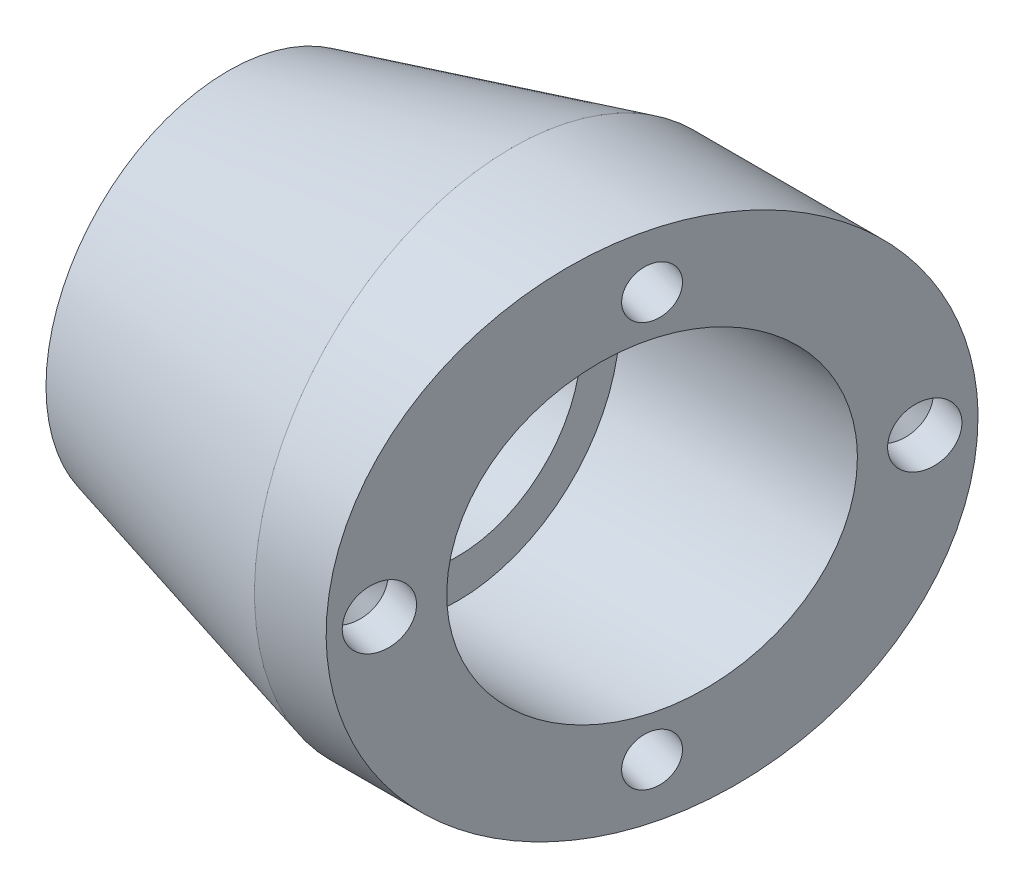
ISO-10303-21;
HEADER;
FILE_DESCRIPTION(('STEP AP214'),'2;1');
FILE_NAME('part.step','',(''),(''),'','','');
FILE_SCHEMA(('AUTOMOTIVE_DESIGN { 1 0 10303 214 1 1 1 1 }'));
ENDSEC;
DATA;
#1=APPLICATION_CONTEXT('core data for automotive mechanical design processes');
#2=APPLICATION_PROTOCOL_DEFINITION('international standard','automotive_design',2000,#1);
#3=PRODUCT_CONTEXT('',#1,'mechanical');
#4=PRODUCT('Part','Part','',(#3));
#5=PRODUCT_RELATED_PRODUCT_CATEGORY('part','',(#4));
#6=PRODUCT_DEFINITION_FORMATION('','',#4);
#7=PRODUCT_DEFINITION_CONTEXT('part definition',#1,'design');
#8=PRODUCT_DEFINITION('design','',#6,#7);
#9=PRODUCT_DEFINITION_SHAPE('','',#8);
#10=(LENGTH_UNIT() NAMED_UNIT(*) SI_UNIT(.MILLI.,.METRE.));
#11=(NAMED_UNIT(*) PLANE_ANGLE_UNIT() SI_UNIT($,.RADIAN.));
#12=(NAMED_UNIT(*) SI_UNIT($,.STERADIAN.) SOLID_ANGLE_UNIT());
#13=UNCERTAINTY_MEASURE_WITH_UNIT(LENGTH_MEASURE(1.E-05),#10,'distance_accuracy_value','');
#14=(GEOMETRIC_REPRESENTATION_CONTEXT(3) GLOBAL_UNCERTAINTY_ASSIGNED_CONTEXT((#13)) GLOBAL_UNIT_ASSIGNED_CONTEXT((#10,
#11,#12)) REPRESENTATION_CONTEXT('',''));
#15=CARTESIAN_POINT('',(0.,0.,0.));
#16=DIRECTION('',(0.,0.,1.));
#17=DIRECTION('',(1.,0.,0.));
#18=AXIS2_PLACEMENT_3D('',#15,#16,#17);
#19=CARTESIAN_POINT('',(0.254,0.,0.));
#20=DIRECTION('',(1.,0.,0.));
#21=DIRECTION('',(0.,0.,-1.));
#22=AXIS2_PLACEMENT_3D('',#19,#20,#21);
#23=CYLINDRICAL_SURFACE('',#22,8.001);
#24=CARTESIAN_POINT('',(0.254000000113976,0.,0.));
#25=DIRECTION('',(-1.,0.,0.));
#26=DIRECTION('',(0.,-1.,0.));
#27=AXIS2_PLACEMENT_3D('',#24,#25,#26);
#28=CIRCLE('',#27,8.00100000011398);
#29=CARTESIAN_POINT('',(0.254000000113976,-8.00100000011398,0.));
#30=VERTEX_POINT('',#29);
#31=EDGE_CURVE('E102',#30,#30,#28,.T.);
#32=ORIENTED_EDGE('',*,*,#31,.T.);
#33=EDGE_LOOP('',(#32));
#34=FACE_BOUND('',#33,.T.);
#35=CARTESIAN_POINT('',(4.99999999999999,0.,0.));
#36=DIRECTION('',(1.,0.,0.));
#37=DIRECTION('',(0.,0.,-1.));
#38=AXIS2_PLACEMENT_3D('',#35,#36,#37);
#39=CIRCLE('',#38,8.001);
#40=CARTESIAN_POINT('',(4.99999999999999,0.,-8.001));
#41=VERTEX_POINT('',#40);
#42=EDGE_CURVE('E20',#41,#41,#39,.F.);
#43=ORIENTED_EDGE('',*,*,#42,.F.);
#44=EDGE_LOOP('',(#43));
#45=FACE_BOUND('',#44,.T.);
#46=ADVANCED_FACE('F16',(#34,#45),#23,.F.);
#47=CARTESIAN_POINT('',(-1.13975994441018E-10,0.,0.));
#48=DIRECTION('',(-1.,0.,0.));
#49=DIRECTION('',(0.,0.,1.));
#50=AXIS2_PLACEMENT_3D('',#47,#48,#49);
#51=CONICAL_SURFACE('',#50,8.25499999988603,0.785398162499999);
#52=CARTESIAN_POINT('',(-1.13976536542104E-10,0.,0.));
#53=DIRECTION('',(-1.,0.,0.));
#54=DIRECTION('',(0.,0.,1.));
#55=AXIS2_PLACEMENT_3D('',#52,#53,#54);
#56=CIRCLE('',#55,8.25499999988603);
#57=CARTESIAN_POINT('',(-1.13976536542104E-10,0.,8.25499999988603));
#58=VERTEX_POINT('',#57);
#59=EDGE_CURVE('E106',#58,#58,#56,.F.);
#60=ORIENTED_EDGE('',*,*,#59,.F.);
#61=EDGE_LOOP('',(#60));
#62=FACE_BOUND('',#61,.T.);
#63=ORIENTED_EDGE('',*,*,#31,.F.);
#64=EDGE_LOOP('',(#63));
#65=FACE_BOUND('',#64,.T.);
#66=ADVANCED_FACE('F90',(#62,#65),#51,.F.);
#67=CARTESIAN_POINT('',(4.99999999999999,7.0485,0.));
#68=DIRECTION('',(-1.,0.,0.));
#69=DIRECTION('',(0.,0.,1.));
#70=AXIS2_PLACEMENT_3D('',#67,#68,#69);
#71=PLANE('',#70);
#72=CARTESIAN_POINT('',(4.99999999999999,0.,0.));
#73=DIRECTION('',(1.,0.,0.));
#74=DIRECTION('',(0.,0.,-1.));
#75=AXIS2_PLACEMENT_3D('',#72,#73,#74);
#76=CIRCLE('',#75,6.096);
#77=CARTESIAN_POINT('',(4.99999999999999,0.,-6.096));
#78=VERTEX_POINT('',#77);
#79=EDGE_CURVE('E108',#78,#78,#76,.T.);
#80=ORIENTED_EDGE('',*,*,#79,.T.);
#81=EDGE_LOOP('',(#80));
#82=FACE_BOUND('',#81,.T.);
#83=ORIENTED_EDGE('',*,*,#42,.T.);
#84=EDGE_LOOP('',(#83));
#85=FACE_BOUND('',#84,.T.);
#86=ADVANCED_FACE('F86',(#82,#85),#71,.T.);
#87=CARTESIAN_POINT('',(0.,10.3505,0.));
#88=DIRECTION('',(-1.,0.,0.));
#89=DIRECTION('',(0.,0.,1.));
#90=AXIS2_PLACEMENT_3D('',#87,#88,#89);
#91=PLANE('',#90);
#92=ORIENTED_EDGE('',*,*,#59,.T.);
#93=EDGE_LOOP('',(#92));
#94=FACE_BOUND('',#93,.T.);
#95=CARTESIAN_POINT('',(-5.46201972539961E-10,0.,0.));
#96=DIRECTION('',(1.,0.,0.));
#97=DIRECTION('',(0.,1.,0.));
#98=AXIS2_PLACEMENT_3D('',#95,#96,#97);
#99=CIRCLE('',#98,9.00000000206669);
#100=CARTESIAN_POINT('',(-5.46201357874163E-10,9.0000000020667,0.));
#101=VERTEX_POINT('',#100);
#102=EDGE_CURVE('E135',#101,#101,#99,.T.);
#103=ORIENTED_EDGE('',*,*,#102,.F.);
#104=EDGE_LOOP('',(#103));
#105=FACE_BOUND('',#104,.T.);
#106=ADVANCED_FACE('F82',(#94,#105),#91,.T.);
#107=CARTESIAN_POINT('',(4.99999999999999,0.,0.));
#108=DIRECTION('',(1.,0.,0.));
#109=DIRECTION('',(0.,0.,-1.));
#110=AXIS2_PLACEMENT_3D('',#107,#108,#109);
#111=CYLINDRICAL_SURFACE('',#110,6.096);
#112=ORIENTED_EDGE('',*,*,#79,.F.);
#113=EDGE_LOOP('',(#112));
#114=FACE_BOUND('',#113,.T.);
#115=CARTESIAN_POINT('',(11.35,0.,0.));
#116=DIRECTION('',(1.,0.,0.));
#117=DIRECTION('',(0.,0.,-1.));
#118=AXIS2_PLACEMENT_3D('',#115,#116,#117);
#119=CIRCLE('',#118,6.096);
#120=CARTESIAN_POINT('',(11.35,0.,-6.096));
#121=VERTEX_POINT('',#120);
#122=EDGE_CURVE('E132',#121,#121,#119,.F.);
#123=ORIENTED_EDGE('',*,*,#122,.F.);
#124=EDGE_LOOP('',(#123));
#125=FACE_BOUND('',#124,.T.);
#126=ADVANCED_FACE('F53',(#114,#125),#111,.F.);
#127=CARTESIAN_POINT('',(14.0000000005462,0.,0.));
#128=DIRECTION('',(1.,0.,0.));
#129=DIRECTION('',(0.,1.,0.));
#130=AXIS2_PLACEMENT_3D('',#127,#128,#129);
#131=CONICAL_SURFACE('',#130,12.6999999979333,0.258378195831585);
#132=ORIENTED_EDGE('',*,*,#102,.T.);
#133=EDGE_LOOP('',(#132));
#134=FACE_BOUND('',#133,.T.);
#135=CARTESIAN_POINT('',(14.,0.,0.));
#136=DIRECTION('',(1.,0.,0.));
#137=DIRECTION('',(0.,1.,0.));
#138=AXIS2_PLACEMENT_3D('',#135,#136,#137);
#139=CIRCLE('',#138,12.7);
#140=CARTESIAN_POINT('',(14.,12.7,0.));
#141=VERTEX_POINT('',#140);
#142=EDGE_CURVE('E111',#141,#141,#139,.T.);
#143=ORIENTED_EDGE('',*,*,#142,.F.);
#144=EDGE_LOOP('',(#143));
#145=FACE_BOUND('',#144,.T.);
#146=ADVANCED_FACE('F42',(#134,#145),#131,.T.);
#147=CARTESIAN_POINT('',(15.7414932001015,10.,-1.39380526263836));
#148=DIRECTION('',(0.965925826289068,0.,0.258819045102523));
#149=DIRECTION('',(0.258819045102522,0.,-0.965925826289068));
#150=AXIS2_PLACEMENT_3D('',#147,#148,#149);
#151=CONICAL_SURFACE('',#150,2.25261581177498,1.02974425867665);
#152=CARTESIAN_POINT('',(15.1476902983903,10.,-1.55291427061513));
#153=DIRECTION('',(0.965925826289069,0.,0.258819045102519));
#154=DIRECTION('',(0.258819045102519,0.,-0.965925826289069));
#155=AXIS2_PLACEMENT_3D('',#152,#153,#154);
#156=CIRCLE('',#155,1.22950000000001);
#157=CARTESIAN_POINT('',(15.4659083143439,10.,-2.74052007403756));
#158=VERTEX_POINT('',#157);
#159=EDGE_CURVE('E150',#158,#158,#156,.T.);
#160=ORIENTED_EDGE('',*,*,#159,.T.);
#161=EDGE_LOOP('',(#160));
#162=FACE_BOUND('',#161,.T.);
#163=CARTESIAN_POINT('',(14.4341047401852,10.,-1.74411894466669));
#164=VERTEX_POINT('',#163);
#165=VERTEX_LOOP('',#164);
#166=FACE_BOUND('',#165,.T.);
#167=ADVANCED_FACE('F39',(#162,#166),#151,.F.);
#168=CARTESIAN_POINT('',(15.7414932001015,-10.,-1.39380526263836));
#169=DIRECTION('',(0.965925826289068,0.,0.258819045102523));
#170=DIRECTION('',(0.258819045102522,0.,-0.965925826289068));
#171=AXIS2_PLACEMENT_3D('',#168,#169,#170);
#172=CONICAL_SURFACE('',#171,2.25261581177499,1.02974425867665);
#173=CARTESIAN_POINT('',(15.1476902983903,-10.,-1.55291427061514));
#174=DIRECTION('',(0.965925826289069,0.,0.258819045102519));
#175=DIRECTION('',(0.258819045102519,0.,-0.965925826289069));
#176=AXIS2_PLACEMENT_3D('',#173,#174,#175);
#177=CIRCLE('',#176,1.2295);
#178=CARTESIAN_POINT('',(15.4659083143439,-10.,-2.74052007403755));
#179=VERTEX_POINT('',#178);
#180=EDGE_CURVE('E151',#179,#179,#177,.T.);
#181=ORIENTED_EDGE('',*,*,#180,.T.);
#182=EDGE_LOOP('',(#181));
#183=FACE_BOUND('',#182,.T.);
#184=CARTESIAN_POINT('',(14.4341047401852,-10.,-1.74411894466669));
#185=VERTEX_POINT('',#184);
#186=VERTEX_LOOP('',#185);
#187=FACE_BOUND('',#186,.T.);
#188=ADVANCED_FACE('F41',(#183,#187),#172,.F.);
#189=CARTESIAN_POINT('',(16.8888284771357,0.,10.3016602828016));
#190=DIRECTION('',(0.965925826289068,0.,0.258819045102521));
#191=DIRECTION('',(0.258819045102521,0.,-0.965925826289068));
#192=AXIS2_PLACEMENT_3D('',#189,#190,#191);
#193=CONICAL_SURFACE('',#192,2.74820961176289,1.02974425867665);
#194=CARTESIAN_POINT('',(16.1643841074189,0.,10.1075459989747));
#195=DIRECTION('',(0.965925826289069,0.,0.258819045102519));
#196=DIRECTION('',(0.258819045102519,0.,-0.965925826289069));
#197=AXIS2_PLACEMENT_3D('',#194,#195,#196);
#198=CIRCLE('',#197,1.5);
#199=CARTESIAN_POINT('',(16.5526126750727,0.,8.65865725954111));
#200=VERTEX_POINT('',#199);
#201=EDGE_CURVE('E154',#200,#200,#198,.T.);
#202=ORIENTED_EDGE('',*,*,#201,.T.);
#203=EDGE_LOOP('',(#202));
#204=FACE_BOUND('',#203,.T.);
#205=CARTESIAN_POINT('',(15.2938039225408,0.,9.87427474149009));
#206=VERTEX_POINT('',#205);
#207=VERTEX_LOOP('',#206);
#208=FACE_BOUND('',#207,.T.);
#209=ADVANCED_FACE('F50',(#204,#208),#193,.F.);
#210=CARTESIAN_POINT('',(22.5828474693911,0.,-10.9487078955579));
#211=DIRECTION('',(0.965925826289068,0.,0.258819045102522));
#212=DIRECTION('',(0.258819045102522,0.,-0.965925826289068));
#213=AXIS2_PLACEMENT_3D('',#210,#211,#212);
#214=CONICAL_SURFACE('',#213,2.74820961176289,1.02974425867665);
#215=CARTESIAN_POINT('',(21.8584030996743,0.,-11.1428221793848));
#216=DIRECTION('',(0.965925826289069,0.,0.258819045102518));
#217=DIRECTION('',(0.258819045102518,0.,-0.965925826289069));
#218=AXIS2_PLACEMENT_3D('',#215,#216,#217);
#219=CIRCLE('',#218,1.5);
#220=CARTESIAN_POINT('',(22.2466316673281,0.,-12.5917109188184));
#221=VERTEX_POINT('',#220);
#222=EDGE_CURVE('E131',#221,#221,#219,.T.);
#223=ORIENTED_EDGE('',*,*,#222,.T.);
#224=EDGE_LOOP('',(#223));
#225=FACE_BOUND('',#224,.T.);
#226=CARTESIAN_POINT('',(20.9878229147962,0.,-11.3760934368694));
#227=VERTEX_POINT('',#226);
#228=VERTEX_LOOP('',#227);
#229=FACE_BOUND('',#228,.T.);
#230=ADVANCED_FACE('F77',(#225,#229),#214,.F.);
#231=CARTESIAN_POINT('',(11.35,7.0485,0.));
#232=DIRECTION('',(1.,0.,0.));
#233=DIRECTION('',(0.,0.,-1.));
#234=AXIS2_PLACEMENT_3D('',#231,#232,#233);
#235=PLANE('',#234);
#236=ORIENTED_EDGE('',*,*,#122,.T.);
#237=EDGE_LOOP('',(#236));
#238=FACE_BOUND('',#237,.T.);
#239=CARTESIAN_POINT('',(11.35,0.,0.));
#240=DIRECTION('',(1.,0.,0.));
#241=DIRECTION('',(0.,0.,-1.));
#242=AXIS2_PLACEMENT_3D('',#239,#240,#241);
#243=CIRCLE('',#242,8.001);
#244=CARTESIAN_POINT('',(11.35,0.,-8.001));
#245=VERTEX_POINT('',#244);
#246=EDGE_CURVE('E128',#245,#245,#243,.T.);
#247=ORIENTED_EDGE('',*,*,#246,.T.);
#248=EDGE_LOOP('',(#247));
#249=FACE_BOUND('',#248,.T.);
#250=ADVANCED_FACE('F74',(#238,#249),#235,.T.);
#251=CARTESIAN_POINT('',(14.,0.,0.));
#252=DIRECTION('',(1.,0.,0.));
#253=DIRECTION('',(0.,0.,-1.));
#254=AXIS2_PLACEMENT_3D('',#251,#252,#253);
#255=CYLINDRICAL_SURFACE('',#254,12.7);
#256=ORIENTED_EDGE('',*,*,#142,.T.);
#257=EDGE_LOOP('',(#256));
#258=FACE_BOUND('',#257,.T.);
#259=CARTESIAN_POINT('',(20.9432452561248,0.,0.));
#260=DIRECTION('',(-0.965925826289068,0.,-0.258819045102521));
#261=DIRECTION('',(0.258819045102521,0.,-0.965925826289068));
#262=AXIS2_PLACEMENT_3D('',#259,#260,#261);
#263=ELLIPSE('',#262,13.1480074912081,12.7);
#264=CARTESIAN_POINT('',(24.3462,0.,-12.7));
#265=VERTEX_POINT('',#264);
#266=EDGE_CURVE('E125',#265,#265,#263,.T.);
#267=ORIENTED_EDGE('',*,*,#266,.T.);
#268=EDGE_LOOP('',(#267));
#269=FACE_BOUND('',#268,.T.);
#270=ADVANCED_FACE('F70',(#258,#269),#255,.T.);
#271=CARTESIAN_POINT('',(21.5370481578359,10.,0.159109007976775));
#272=DIRECTION('',(-0.965925826289069,0.,-0.25881904510252));
#273=DIRECTION('',(-0.25881904510252,0.,0.965925826289069));
#274=AXIS2_PLACEMENT_3D('',#271,#272,#273);
#275=CYLINDRICAL_SURFACE('',#274,1.2295);
#276=ORIENTED_EDGE('',*,*,#159,.F.);
#277=EDGE_LOOP('',(#276));
#278=FACE_BOUND('',#277,.T.);
#279=CARTESIAN_POINT('',(20.9432452561248,10.,0.));
#280=DIRECTION('',(-0.965925826289069,0.,-0.25881904510252));
#281=DIRECTION('',(-0.25881904510252,0.,0.965925826289069));
#282=AXIS2_PLACEMENT_3D('',#279,#280,#281);
#283=CIRCLE('',#282,1.2295);
#284=CARTESIAN_POINT('',(20.6250272401712,10.,1.18760580342242));
#285=VERTEX_POINT('',#284);
#286=EDGE_CURVE('E122',#285,#285,#283,.F.);
#287=ORIENTED_EDGE('',*,*,#286,.T.);
#288=EDGE_LOOP('',(#287));
#289=FACE_BOUND('',#288,.T.);
#290=ADVANCED_FACE('F73',(#278,#289),#275,.F.);
#291=CARTESIAN_POINT('',(21.5370481578359,-10.,0.159109007976773));
#292=DIRECTION('',(-0.965925826289069,0.,-0.25881904510252));
#293=DIRECTION('',(-0.25881904510252,0.,0.965925826289069));
#294=AXIS2_PLACEMENT_3D('',#291,#292,#293);
#295=CYLINDRICAL_SURFACE('',#294,1.22949999999999);
#296=ORIENTED_EDGE('',*,*,#180,.F.);
#297=EDGE_LOOP('',(#296));
#298=FACE_BOUND('',#297,.T.);
#299=CARTESIAN_POINT('',(20.9432452561248,-10.,0.));
#300=DIRECTION('',(-0.965925826289069,0.,-0.25881904510252));
#301=DIRECTION('',(-0.25881904510252,0.,0.965925826289069));
#302=AXIS2_PLACEMENT_3D('',#299,#300,#301);
#303=CIRCLE('',#302,1.22949999999999);
#304=CARTESIAN_POINT('',(20.6250272401712,-10.,1.18760580342241));
#305=VERTEX_POINT('',#304);
#306=EDGE_CURVE('E119',#305,#305,#303,.F.);
#307=ORIENTED_EDGE('',*,*,#306,.T.);
#308=EDGE_LOOP('',(#307));
#309=FACE_BOUND('',#308,.T.);
#310=ADVANCED_FACE('F178',(#298,#309),#295,.F.);
#311=CARTESIAN_POINT('',(18.8206801297138,0.,10.8192983730066));
#312=DIRECTION('',(-0.965925826289068,0.,-0.258819045102522));
#313=DIRECTION('',(-0.258819045102522,0.,0.965925826289068));
#314=AXIS2_PLACEMENT_3D('',#311,#312,#313);
#315=CYLINDRICAL_SURFACE('',#314,1.5);
#316=ORIENTED_EDGE('',*,*,#201,.F.);
#317=EDGE_LOOP('',(#316));
#318=FACE_BOUND('',#317,.T.);
#319=CARTESIAN_POINT('',(18.096235759997,0.,10.6251840891798));
#320=DIRECTION('',(-0.965925826289068,0.,-0.258819045102522));
#321=DIRECTION('',(-0.258819045102522,0.,0.965925826289068));
#322=AXIS2_PLACEMENT_3D('',#319,#320,#321);
#323=CIRCLE('',#322,1.5);
#324=CARTESIAN_POINT('',(17.7080071923432,0.,12.0740728286134));
#325=VERTEX_POINT('',#324);
#326=EDGE_CURVE('E116',#325,#325,#323,.F.);
#327=ORIENTED_EDGE('',*,*,#326,.T.);
#328=EDGE_LOOP('',(#327));
#329=FACE_BOUND('',#328,.T.);
#330=ADVANCED_FACE('F165',(#318,#329),#315,.F.);
#331=CARTESIAN_POINT('',(24.5146991219693,0.,-10.4310698053529));
#332=DIRECTION('',(-0.965925826289067,0.,-0.258819045102525));
#333=DIRECTION('',(-0.258819045102525,0.,0.965925826289067));
#334=AXIS2_PLACEMENT_3D('',#331,#332,#333);
#335=CYLINDRICAL_SURFACE('',#334,1.49999999999999);
#336=ORIENTED_EDGE('',*,*,#222,.F.);
#337=EDGE_LOOP('',(#336));
#338=FACE_BOUND('',#337,.T.);
#339=CARTESIAN_POINT('',(23.7902547522525,0.,-10.6251840891797));
#340=DIRECTION('',(-0.965925826289067,0.,-0.258819045102525));
#341=DIRECTION('',(-0.258819045102525,0.,0.965925826289067));
#342=AXIS2_PLACEMENT_3D('',#339,#340,#341);
#343=CIRCLE('',#342,1.49999999999999);
#344=CARTESIAN_POINT('',(23.4020261845987,0.,-9.17629534974616));
#345=VERTEX_POINT('',#344);
#346=EDGE_CURVE('E26',#345,#345,#343,.F.);
#347=ORIENTED_EDGE('',*,*,#346,.T.);
#348=EDGE_LOOP('',(#347));
#349=FACE_BOUND('',#348,.T.);
#350=ADVANCED_FACE('F18',(#338,#349),#335,.F.);
#351=CARTESIAN_POINT('',(11.35,0.,0.));
#352=DIRECTION('',(1.,0.,0.));
#353=DIRECTION('',(0.,0.,-1.));
#354=AXIS2_PLACEMENT_3D('',#351,#352,#353);
#355=CYLINDRICAL_SURFACE('',#354,8.001);
#356=ORIENTED_EDGE('',*,*,#246,.F.);
#357=EDGE_LOOP('',(#356));
#358=FACE_BOUND('',#357,.T.);
#359=CARTESIAN_POINT('',(20.9432452561248,0.,0.));
#360=DIRECTION('',(-0.965925826289068,0.,-0.258819045102521));
#361=DIRECTION('',(0.258819045102521,0.,-0.965925826289068));
#362=AXIS2_PLACEMENT_3D('',#359,#360,#361);
#363=ELLIPSE('',#362,8.28324471946108,8.001);
#364=CARTESIAN_POINT('',(23.0871067447662,0.,-8.001));
#365=VERTEX_POINT('',#364);
#366=EDGE_CURVE('E11',#365,#365,#363,.F.);
#367=ORIENTED_EDGE('',*,*,#366,.T.);
#368=EDGE_LOOP('',(#367));
#369=FACE_BOUND('',#368,.T.);
#370=ADVANCED_FACE('F60',(#358,#369),#355,.F.);
#371=CARTESIAN_POINT('',(17.5402905122495,0.,12.7));
#372=DIRECTION('',(-0.965925826289068,0.,-0.258819045102521));
#373=DIRECTION('',(-0.258819045102521,0.,0.965925826289068));
#374=AXIS2_PLACEMENT_3D('',#371,#372,#373);
#375=PLANE('',#374);
#376=ORIENTED_EDGE('',*,*,#366,.F.);
#377=EDGE_LOOP('',(#376));
#378=FACE_BOUND('',#377,.T.);
#379=ORIENTED_EDGE('',*,*,#346,.F.);
#380=EDGE_LOOP('',(#379));
#381=FACE_BOUND('',#380,.T.);
#382=ORIENTED_EDGE('',*,*,#326,.F.);
#383=EDGE_LOOP('',(#382));
#384=FACE_BOUND('',#383,.T.);
#385=ORIENTED_EDGE('',*,*,#306,.F.);
#386=EDGE_LOOP('',(#385));
#387=FACE_BOUND('',#386,.T.);
#388=ORIENTED_EDGE('',*,*,#286,.F.);
#389=EDGE_LOOP('',(#388));
#390=FACE_BOUND('',#389,.T.);
#391=ORIENTED_EDGE('',*,*,#266,.F.);
#392=EDGE_LOOP('',(#391));
#393=FACE_BOUND('',#392,.T.);
#394=ADVANCED_FACE('F58',(#378,#381,#384,#387,#390,#393),#375,.F.);
#395=CLOSED_SHELL('',(#46,#66,#86,#106,#126,#146,#167,#188,#209,#230,#250,#270,#290,#310,#330,
#350,#370,#394));
#396=MANIFOLD_SOLID_BREP('B1',#395);
#397=ADVANCED_BREP_SHAPE_REPRESENTATION('',(#18,#396),#14);
#398=SHAPE_DEFINITION_REPRESENTATION(#9,#397);
ENDSEC;
END-ISO-10303-21;
